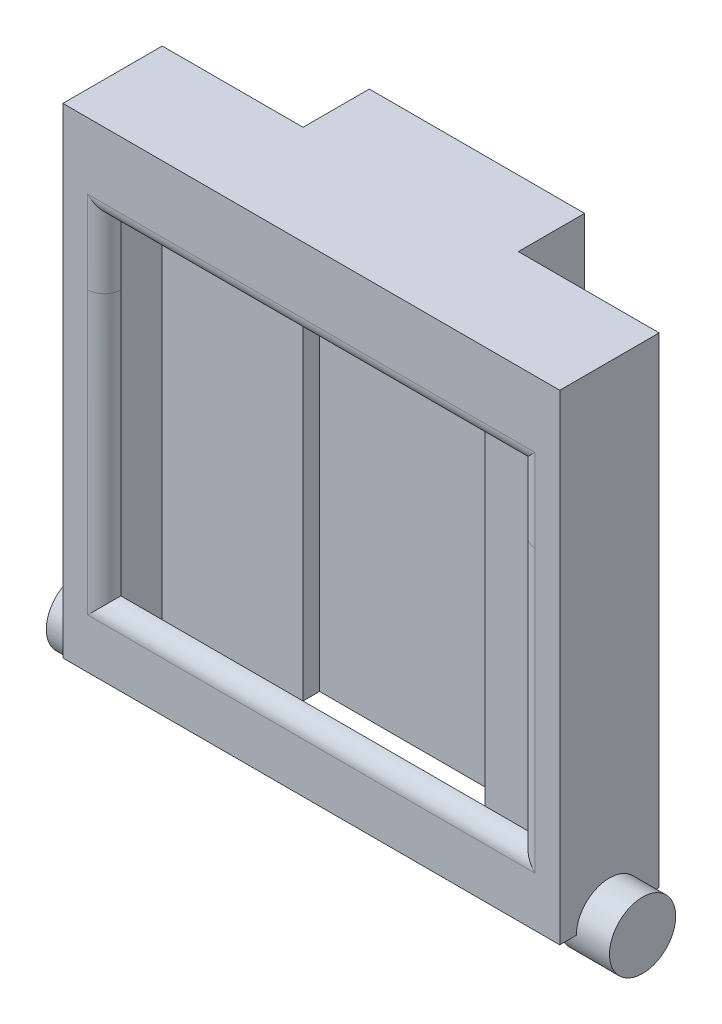
ISO-10303-21;
HEADER;
FILE_DESCRIPTION(('STEP AP214'),'2;1');
FILE_NAME('part.step','',(''),(''),'','','');
FILE_SCHEMA(('AUTOMOTIVE_DESIGN { 1 0 10303 214 1 1 1 1 }'));
ENDSEC;
DATA;
#1=APPLICATION_CONTEXT('core data for automotive mechanical design processes');
#2=APPLICATION_PROTOCOL_DEFINITION('international standard','automotive_design',2000,#1);
#3=PRODUCT_CONTEXT('',#1,'mechanical');
#4=PRODUCT('Part','Part','',(#3));
#5=PRODUCT_RELATED_PRODUCT_CATEGORY('part','',(#4));
#6=PRODUCT_DEFINITION_FORMATION('','',#4);
#7=PRODUCT_DEFINITION_CONTEXT('part definition',#1,'design');
#8=PRODUCT_DEFINITION('design','',#6,#7);
#9=PRODUCT_DEFINITION_SHAPE('','',#8);
#10=(LENGTH_UNIT() NAMED_UNIT(*) SI_UNIT(.MILLI.,.METRE.));
#11=(NAMED_UNIT(*) PLANE_ANGLE_UNIT() SI_UNIT($,.RADIAN.));
#12=(NAMED_UNIT(*) SI_UNIT($,.STERADIAN.) SOLID_ANGLE_UNIT());
#13=UNCERTAINTY_MEASURE_WITH_UNIT(LENGTH_MEASURE(1.E-05),#10,'distance_accuracy_value','');
#14=(GEOMETRIC_REPRESENTATION_CONTEXT(3) GLOBAL_UNCERTAINTY_ASSIGNED_CONTEXT((#13)) GLOBAL_UNIT_ASSIGNED_CONTEXT((#10,
#11,#12)) REPRESENTATION_CONTEXT('',''));
#15=CARTESIAN_POINT('',(0.,0.,0.));
#16=DIRECTION('',(0.,0.,1.));
#17=DIRECTION('',(1.,0.,0.));
#18=AXIS2_PLACEMENT_3D('',#15,#16,#17);
#19=CARTESIAN_POINT('',(0.,0.,-1.));
#20=DIRECTION('',(0.,0.,-1.));
#21=DIRECTION('',(-1.,0.,0.));
#22=AXIS2_PLACEMENT_3D('',#19,#20,#21);
#23=PLANE('',#22);
#24=DIRECTION('',(0.,-1.,0.));
#25=VECTOR('',#24,1.);
#26=CARTESIAN_POINT('',(20.5,29.,-1.));
#27=LINE('',#26,#25);
#28=CARTESIAN_POINT('',(20.5,29.,-1.));
#29=VERTEX_POINT('',#28);
#30=CARTESIAN_POINT('',(20.5,0.,-1.));
#31=VERTEX_POINT('',#30);
#32=EDGE_CURVE('E221',#29,#31,#27,.T.);
#33=ORIENTED_EDGE('',*,*,#32,.F.);
#34=DIRECTION('',(-1.,0.,0.));
#35=VECTOR('',#34,1.);
#36=CARTESIAN_POINT('',(0.,29.,-1.));
#37=LINE('',#36,#35);
#38=CARTESIAN_POINT('',(29.,29.,-1.));
#39=VERTEX_POINT('',#38);
#40=EDGE_CURVE('E346',#39,#29,#37,.T.);
#41=ORIENTED_EDGE('',*,*,#40,.F.);
#42=DIRECTION('',(0.,1.,0.));
#43=VECTOR('',#42,1.);
#44=CARTESIAN_POINT('',(29.,0.,-1.));
#45=LINE('',#44,#43);
#46=CARTESIAN_POINT('',(29.,0.,-1.));
#47=VERTEX_POINT('',#46);
#48=EDGE_CURVE('E360',#47,#39,#45,.T.);
#49=ORIENTED_EDGE('',*,*,#48,.F.);
#50=DIRECTION('',(1.,0.,0.));
#51=VECTOR('',#50,1.);
#52=CARTESIAN_POINT('',(0.,0.,-1.));
#53=LINE('',#52,#51);
#54=EDGE_CURVE('E78',#31,#47,#53,.T.);
#55=ORIENTED_EDGE('',*,*,#54,.F.);
#56=EDGE_LOOP('',(#33,#41,#49,#55));
#57=FACE_BOUND('',#56,.T.);
#58=ADVANCED_FACE('F34',(#57),#23,.T.);
#59=CARTESIAN_POINT('',(0.,0.,0.));
#60=DIRECTION('',(0.,0.,-1.));
#61=DIRECTION('',(-1.,0.,0.));
#62=AXIS2_PLACEMENT_3D('',#59,#60,#61);
#63=PLANE('',#62);
#64=DIRECTION('',(1.,0.,0.));
#65=VECTOR('',#64,1.);
#66=CARTESIAN_POINT('',(0.,0.,0.));
#67=LINE('',#66,#65);
#68=CARTESIAN_POINT('',(0.,0.,0.));
#69=VERTEX_POINT('',#68);
#70=CARTESIAN_POINT('',(8.5,0.,0.));
#71=VERTEX_POINT('',#70);
#72=EDGE_CURVE('E326',#69,#71,#67,.T.);
#73=ORIENTED_EDGE('',*,*,#72,.T.);
#74=DIRECTION('',(0.,-1.,0.));
#75=VECTOR('',#74,1.);
#76=CARTESIAN_POINT('',(8.5,0.,0.));
#77=LINE('',#76,#75);
#78=CARTESIAN_POINT('',(8.5,28.,0.));
#79=VERTEX_POINT('',#78);
#80=EDGE_CURVE('E268',#79,#71,#77,.T.);
#81=ORIENTED_EDGE('',*,*,#80,.F.);
#82=DIRECTION('',(-1.,0.,0.));
#83=VECTOR('',#82,1.);
#84=CARTESIAN_POINT('',(0.,28.,0.));
#85=LINE('',#84,#83);
#86=CARTESIAN_POINT('',(0.,28.,0.));
#87=VERTEX_POINT('',#86);
#88=EDGE_CURVE('E331',#79,#87,#85,.T.);
#89=ORIENTED_EDGE('',*,*,#88,.T.);
#90=DIRECTION('',(0.,-1.,0.));
#91=VECTOR('',#90,1.);
#92=CARTESIAN_POINT('',(0.,0.,0.));
#93=LINE('',#92,#91);
#94=EDGE_CURVE('E307',#87,#69,#93,.T.);
#95=ORIENTED_EDGE('',*,*,#94,.T.);
#96=EDGE_LOOP('',(#73,#81,#89,#95));
#97=FACE_BOUND('',#96,.T.);
#98=ADVANCED_FACE('F414',(#97),#63,.F.);
#99=CARTESIAN_POINT('',(0.,0.,4.));
#100=DIRECTION('',(0.,1.,0.));
#101=DIRECTION('',(0.,0.,1.));
#102=AXIS2_PLACEMENT_3D('',#99,#100,#101);
#103=PLANE('',#102);
#104=DIRECTION('',(0.,0.,1.));
#105=VECTOR('',#104,1.);
#106=CARTESIAN_POINT('',(20.5,0.,-5.));
#107=LINE('',#106,#105);
#108=CARTESIAN_POINT('',(20.5,0.,-5.));
#109=VERTEX_POINT('',#108);
#110=EDGE_CURVE('E251',#109,#31,#107,.T.);
#111=ORIENTED_EDGE('',*,*,#110,.T.);
#112=ORIENTED_EDGE('',*,*,#54,.T.);
#113=DIRECTION('',(0.,0.,-1.));
#114=VECTOR('',#113,1.);
#115=CARTESIAN_POINT('',(29.,0.,4.));
#116=LINE('',#115,#114);
#117=CARTESIAN_POINT('',(29.,0.,0.));
#118=VERTEX_POINT('',#117);
#119=EDGE_CURVE('E359',#118,#47,#116,.T.);
#120=ORIENTED_EDGE('',*,*,#119,.F.);
#121=DIRECTION('',(1.,0.,0.));
#122=VECTOR('',#121,1.);
#123=CARTESIAN_POINT('',(28.,0.,0.));
#124=LINE('',#123,#122);
#125=CARTESIAN_POINT('',(28.,0.,0.));
#126=VERTEX_POINT('',#125);
#127=EDGE_CURVE('E298',#118,#126,#124,.F.);
#128=ORIENTED_EDGE('',*,*,#127,.T.);
#129=CARTESIAN_POINT('',(19.5,0.,0.));
#130=VERTEX_POINT('',#129);
#131=EDGE_CURVE('E325',#130,#126,#67,.T.);
#132=ORIENTED_EDGE('',*,*,#131,.F.);
#133=DIRECTION('',(0.,0.,-1.));
#134=VECTOR('',#133,1.);
#135=CARTESIAN_POINT('',(19.5,0.,5.001));
#136=LINE('',#135,#134);
#137=CARTESIAN_POINT('',(19.5,0.,-1.));
#138=VERTEX_POINT('',#137);
#139=EDGE_CURVE('E259',#130,#138,#136,.T.);
#140=ORIENTED_EDGE('',*,*,#139,.T.);
#141=DIRECTION('',(-1.,0.,0.));
#142=VECTOR('',#141,1.);
#143=CARTESIAN_POINT('',(20.5,0.,-1.));
#144=LINE('',#143,#142);
#145=CARTESIAN_POINT('',(8.5,0.,-1.));
#146=VERTEX_POINT('',#145);
#147=EDGE_CURVE('E224',#138,#146,#144,.T.);
#148=ORIENTED_EDGE('',*,*,#147,.T.);
#149=DIRECTION('',(0.,0.,-1.));
#150=VECTOR('',#149,1.);
#151=CARTESIAN_POINT('',(8.5,0.,5.001));
#152=LINE('',#151,#150);
#153=EDGE_CURVE('E257',#71,#146,#152,.T.);
#154=ORIENTED_EDGE('',*,*,#153,.F.);
#155=ORIENTED_EDGE('',*,*,#72,.F.);
#156=DIRECTION('',(-1.,0.,0.));
#157=VECTOR('',#156,1.);
#158=CARTESIAN_POINT('',(0.,0.,0.));
#159=LINE('',#158,#157);
#160=CARTESIAN_POINT('',(-1.,0.,0.));
#161=VERTEX_POINT('',#160);
#162=EDGE_CURVE('E286',#69,#161,#159,.T.);
#163=ORIENTED_EDGE('',*,*,#162,.T.);
#164=DIRECTION('',(0.,0.,-1.));
#165=VECTOR('',#164,1.);
#166=CARTESIAN_POINT('',(-1.,0.,4.));
#167=LINE('',#166,#165);
#168=CARTESIAN_POINT('',(-1.,0.,-1.));
#169=VERTEX_POINT('',#168);
#170=EDGE_CURVE('E368',#161,#169,#167,.T.);
#171=ORIENTED_EDGE('',*,*,#170,.T.);
#172=CARTESIAN_POINT('',(7.5,0.,-1.));
#173=VERTEX_POINT('',#172);
#174=EDGE_CURVE('E362',#169,#173,#53,.T.);
#175=ORIENTED_EDGE('',*,*,#174,.T.);
#176=DIRECTION('',(0.,0.,1.));
#177=VECTOR('',#176,1.);
#178=CARTESIAN_POINT('',(7.5,0.,-5.));
#179=LINE('',#178,#177);
#180=CARTESIAN_POINT('',(7.5,0.,-5.));
#181=VERTEX_POINT('',#180);
#182=EDGE_CURVE('E248',#181,#173,#179,.T.);
#183=ORIENTED_EDGE('',*,*,#182,.F.);
#184=DIRECTION('',(-1.,0.,0.));
#185=VECTOR('',#184,1.);
#186=CARTESIAN_POINT('',(20.5,0.,-5.));
#187=LINE('',#186,#185);
#188=EDGE_CURVE('E231',#109,#181,#187,.T.);
#189=ORIENTED_EDGE('',*,*,#188,.F.);
#190=EDGE_LOOP('',(#111,#112,#120,#128,#132,#140,#148,#154,#155,#163,#171,#175,#183,#189));
#191=FACE_BOUND('',#190,.T.);
#192=ADVANCED_FACE('F420',(#191),#103,.F.);
#193=CARTESIAN_POINT('',(-1.,0.,5.));
#194=VERTEX_POINT('',#193);
#195=CARTESIAN_POINT('',(-1.,0.,4.));
#196=VERTEX_POINT('',#195);
#197=EDGE_CURVE('E364',#194,#196,#167,.T.);
#198=ORIENTED_EDGE('',*,*,#197,.T.);
#199=DIRECTION('',(-1.,0.,0.));
#200=VECTOR('',#199,1.);
#201=CARTESIAN_POINT('',(0.,0.,4.));
#202=LINE('',#201,#200);
#203=CARTESIAN_POINT('',(0.,0.,4.));
#204=VERTEX_POINT('',#203);
#205=EDGE_CURVE('E283',#196,#204,#202,.F.);
#206=ORIENTED_EDGE('',*,*,#205,.T.);
#207=DIRECTION('',(1.,0.,0.));
#208=VECTOR('',#207,1.);
#209=CARTESIAN_POINT('',(0.,0.,4.));
#210=LINE('',#209,#208);
#211=CARTESIAN_POINT('',(28.,0.,4.));
#212=VERTEX_POINT('',#211);
#213=EDGE_CURVE('E314',#204,#212,#210,.T.);
#214=ORIENTED_EDGE('',*,*,#213,.T.);
#215=DIRECTION('',(1.,0.,0.));
#216=VECTOR('',#215,1.);
#217=CARTESIAN_POINT('',(28.,0.,4.));
#218=LINE('',#217,#216);
#219=CARTESIAN_POINT('',(29.,0.,4.));
#220=VERTEX_POINT('',#219);
#221=EDGE_CURVE('E301',#212,#220,#218,.T.);
#222=ORIENTED_EDGE('',*,*,#221,.T.);
#223=CARTESIAN_POINT('',(29.,0.,5.));
#224=VERTEX_POINT('',#223);
#225=EDGE_CURVE('E371',#224,#220,#116,.T.);
#226=ORIENTED_EDGE('',*,*,#225,.F.);
#227=DIRECTION('',(1.,0.,0.));
#228=VECTOR('',#227,1.);
#229=CARTESIAN_POINT('',(0.,0.,5.));
#230=LINE('',#229,#228);
#231=EDGE_CURVE('E345',#194,#224,#230,.T.);
#232=ORIENTED_EDGE('',*,*,#231,.F.);
#233=EDGE_LOOP('',(#198,#206,#214,#222,#226,#232));
#234=FACE_BOUND('',#233,.T.);
#235=ADVANCED_FACE('F476',(#234),#103,.F.);
#236=CARTESIAN_POINT('',(-1.,0.,4.));
#237=DIRECTION('',(1.,0.,0.));
#238=DIRECTION('',(0.,0.,-1.));
#239=AXIS2_PLACEMENT_3D('',#236,#237,#238);
#240=PLANE('',#239);
#241=ORIENTED_EDGE('',*,*,#170,.F.);
#242=CARTESIAN_POINT('',(-1.,0.,2.));
#243=DIRECTION('',(1.,0.,0.));
#244=DIRECTION('',(0.,0.,-1.));
#245=AXIS2_PLACEMENT_3D('',#242,#243,#244);
#246=CIRCLE('',#245,2.);
#247=EDGE_CURVE('E280',#161,#196,#246,.T.);
#248=ORIENTED_EDGE('',*,*,#247,.T.);
#249=ORIENTED_EDGE('',*,*,#197,.F.);
#250=DIRECTION('',(0.,-1.,0.));
#251=VECTOR('',#250,1.);
#252=CARTESIAN_POINT('',(-1.,0.,5.));
#253=LINE('',#252,#251);
#254=CARTESIAN_POINT('',(-1.,29.,5.));
#255=VERTEX_POINT('',#254);
#256=EDGE_CURVE('E342',#255,#194,#253,.T.);
#257=ORIENTED_EDGE('',*,*,#256,.F.);
#258=DIRECTION('',(0.,0.,-1.));
#259=VECTOR('',#258,1.);
#260=CARTESIAN_POINT('',(-1.,29.,4.));
#261=LINE('',#260,#259);
#262=CARTESIAN_POINT('',(-1.,29.,-1.));
#263=VERTEX_POINT('',#262);
#264=EDGE_CURVE('E347',#255,#263,#261,.T.);
#265=ORIENTED_EDGE('',*,*,#264,.T.);
#266=DIRECTION('',(0.,-1.,0.));
#267=VECTOR('',#266,1.);
#268=CARTESIAN_POINT('',(-1.,0.,-1.));
#269=LINE('',#268,#267);
#270=EDGE_CURVE('E339',#263,#169,#269,.T.);
#271=ORIENTED_EDGE('',*,*,#270,.T.);
#272=EDGE_LOOP('',(#241,#248,#249,#257,#265,#271));
#273=FACE_BOUND('',#272,.T.);
#274=ADVANCED_FACE('F500',(#273),#240,.F.);
#275=CARTESIAN_POINT('',(29.,0.,4.));
#276=DIRECTION('',(-1.,0.,0.));
#277=DIRECTION('',(0.,0.,1.));
#278=AXIS2_PLACEMENT_3D('',#275,#276,#277);
#279=PLANE('',#278);
#280=ORIENTED_EDGE('',*,*,#225,.T.);
#281=CARTESIAN_POINT('',(29.,0.,2.));
#282=DIRECTION('',(-1.,0.,0.));
#283=DIRECTION('',(0.,0.,1.));
#284=AXIS2_PLACEMENT_3D('',#281,#282,#283);
#285=CIRCLE('',#284,2.);
#286=EDGE_CURVE('E295',#220,#118,#285,.T.);
#287=ORIENTED_EDGE('',*,*,#286,.T.);
#288=ORIENTED_EDGE('',*,*,#119,.T.);
#289=ORIENTED_EDGE('',*,*,#48,.T.);
#290=DIRECTION('',(0.,0.,-1.));
#291=VECTOR('',#290,1.);
#292=CARTESIAN_POINT('',(29.,29.,4.));
#293=LINE('',#292,#291);
#294=CARTESIAN_POINT('',(29.,29.,5.));
#295=VERTEX_POINT('',#294);
#296=EDGE_CURVE('E350',#295,#39,#293,.T.);
#297=ORIENTED_EDGE('',*,*,#296,.F.);
#298=DIRECTION('',(0.,1.,0.));
#299=VECTOR('',#298,1.);
#300=CARTESIAN_POINT('',(29.,0.,5.));
#301=LINE('',#300,#299);
#302=EDGE_CURVE('E356',#224,#295,#301,.T.);
#303=ORIENTED_EDGE('',*,*,#302,.F.);
#304=EDGE_LOOP('',(#280,#287,#288,#289,#297,#303));
#305=FACE_BOUND('',#304,.T.);
#306=ADVANCED_FACE('F462',(#305),#279,.F.);
#307=CARTESIAN_POINT('',(0.,29.,4.));
#308=DIRECTION('',(0.,-1.,0.));
#309=DIRECTION('',(0.,0.,-1.));
#310=AXIS2_PLACEMENT_3D('',#307,#308,#309);
#311=PLANE('',#310);
#312=DIRECTION('',(0.,0.,1.));
#313=VECTOR('',#312,1.);
#314=CARTESIAN_POINT('',(7.5,29.,-5.));
#315=LINE('',#314,#313);
#316=CARTESIAN_POINT('',(7.5,29.,-5.));
#317=VERTEX_POINT('',#316);
#318=CARTESIAN_POINT('',(7.5,29.,-1.));
#319=VERTEX_POINT('',#318);
#320=EDGE_CURVE('E245',#317,#319,#315,.T.);
#321=ORIENTED_EDGE('',*,*,#320,.T.);
#322=EDGE_CURVE('E354',#319,#263,#37,.T.);
#323=ORIENTED_EDGE('',*,*,#322,.T.);
#324=ORIENTED_EDGE('',*,*,#264,.F.);
#325=DIRECTION('',(-1.,0.,0.));
#326=VECTOR('',#325,1.);
#327=CARTESIAN_POINT('',(0.,29.,5.));
#328=LINE('',#327,#326);
#329=EDGE_CURVE('E351',#295,#255,#328,.T.);
#330=ORIENTED_EDGE('',*,*,#329,.F.);
#331=ORIENTED_EDGE('',*,*,#296,.T.);
#332=ORIENTED_EDGE('',*,*,#40,.T.);
#333=DIRECTION('',(0.,0.,1.));
#334=VECTOR('',#333,1.);
#335=CARTESIAN_POINT('',(20.5,29.,-5.));
#336=LINE('',#335,#334);
#337=CARTESIAN_POINT('',(20.5,29.,-5.));
#338=VERTEX_POINT('',#337);
#339=EDGE_CURVE('E237',#338,#29,#336,.T.);
#340=ORIENTED_EDGE('',*,*,#339,.F.);
#341=DIRECTION('',(1.,0.,0.));
#342=VECTOR('',#341,1.);
#343=CARTESIAN_POINT('',(20.5,29.,-5.));
#344=LINE('',#343,#342);
#345=EDGE_CURVE('E236',#317,#338,#344,.T.);
#346=ORIENTED_EDGE('',*,*,#345,.F.);
#347=EDGE_LOOP('',(#321,#323,#324,#330,#331,#332,#340,#346));
#348=FACE_BOUND('',#347,.T.);
#349=ADVANCED_FACE('F436',(#348),#311,.F.);
#350=CARTESIAN_POINT('',(0.,0.,5.));
#351=DIRECTION('',(0.,0.,-1.));
#352=DIRECTION('',(-1.,0.,0.));
#353=AXIS2_PLACEMENT_3D('',#350,#351,#352);
#354=PLANE('',#353);
#355=DIRECTION('',(0.,-1.,0.));
#356=VECTOR('',#355,1.);
#357=CARTESIAN_POINT('',(0.500000000000001,0.,5.));
#358=LINE('',#357,#356);
#359=CARTESIAN_POINT('',(0.5,3.,5.));
#360=VERTEX_POINT('',#359);
#361=CARTESIAN_POINT('',(0.499999999999998,20.,5.));
#362=VERTEX_POINT('',#361);
#363=EDGE_CURVE('E376',#360,#362,#358,.F.);
#364=ORIENTED_EDGE('',*,*,#363,.T.);
#365=DIRECTION('',(0.,-1.,0.));
#366=VECTOR('',#365,1.);
#367=CARTESIAN_POINT('',(0.500000000000004,0.,5.));
#368=LINE('',#367,#366);
#369=CARTESIAN_POINT('',(0.500000000000001,25.,5.));
#370=VERTEX_POINT('',#369);
#371=EDGE_CURVE('E388',#362,#370,#368,.F.);
#372=ORIENTED_EDGE('',*,*,#371,.T.);
#373=DIRECTION('',(-1.,0.,0.));
#374=VECTOR('',#373,1.);
#375=CARTESIAN_POINT('',(0.,25.,5.));
#376=LINE('',#375,#374);
#377=CARTESIAN_POINT('',(27.5,25.,5.));
#378=VERTEX_POINT('',#377);
#379=EDGE_CURVE('E59',#370,#378,#376,.F.);
#380=ORIENTED_EDGE('',*,*,#379,.T.);
#381=DIRECTION('',(0.,1.,0.));
#382=VECTOR('',#381,1.);
#383=CARTESIAN_POINT('',(27.5,0.,5.));
#384=LINE('',#383,#382);
#385=CARTESIAN_POINT('',(27.5,20.,5.));
#386=VERTEX_POINT('',#385);
#387=EDGE_CURVE('E386',#378,#386,#384,.F.);
#388=ORIENTED_EDGE('',*,*,#387,.T.);
#389=DIRECTION('',(0.,1.,0.));
#390=VECTOR('',#389,1.);
#391=CARTESIAN_POINT('',(27.5,0.,5.));
#392=LINE('',#391,#390);
#393=CARTESIAN_POINT('',(27.5,3.,5.));
#394=VERTEX_POINT('',#393);
#395=EDGE_CURVE('E379',#386,#394,#392,.F.);
#396=ORIENTED_EDGE('',*,*,#395,.T.);
#397=DIRECTION('',(1.,0.,0.));
#398=VECTOR('',#397,1.);
#399=CARTESIAN_POINT('',(0.,3.,5.));
#400=LINE('',#399,#398);
#401=EDGE_CURVE('E367',#394,#360,#400,.F.);
#402=ORIENTED_EDGE('',*,*,#401,.T.);
#403=EDGE_LOOP('',(#364,#372,#380,#388,#396,#402));
#404=FACE_BOUND('',#403,.T.);
#405=ORIENTED_EDGE('',*,*,#256,.T.);
#406=ORIENTED_EDGE('',*,*,#231,.T.);
#407=ORIENTED_EDGE('',*,*,#302,.T.);
#408=ORIENTED_EDGE('',*,*,#329,.T.);
#409=EDGE_LOOP('',(#405,#406,#407,#408));
#410=FACE_BOUND('',#409,.T.);
#411=ADVANCED_FACE('F392',(#404,#410),#354,.F.);
#412=DIRECTION('',(0.,1.,0.));
#413=VECTOR('',#412,1.);
#414=CARTESIAN_POINT('',(7.5,29.,-1.));
#415=LINE('',#414,#413);
#416=EDGE_CURVE('E232',#173,#319,#415,.T.);
#417=ORIENTED_EDGE('',*,*,#416,.F.);
#418=ORIENTED_EDGE('',*,*,#174,.F.);
#419=ORIENTED_EDGE('',*,*,#270,.F.);
#420=ORIENTED_EDGE('',*,*,#322,.F.);
#421=EDGE_LOOP('',(#417,#418,#419,#420));
#422=FACE_BOUND('',#421,.T.);
#423=ADVANCED_FACE('F416',(#422),#23,.T.);
#424=CARTESIAN_POINT('',(0.,0.,4.));
#425=DIRECTION('',(1.,0.,0.));
#426=DIRECTION('',(0.,0.,-1.));
#427=AXIS2_PLACEMENT_3D('',#424,#425,#426);
#428=PLANE('',#427);
#429=DIRECTION('',(0.,-1.,0.));
#430=VECTOR('',#429,1.);
#431=CARTESIAN_POINT('',(0.,0.,4.));
#432=LINE('',#431,#430);
#433=CARTESIAN_POINT('',(0.,28.,4.));
#434=VERTEX_POINT('',#433);
#435=EDGE_CURVE('E311',#434,#204,#432,.T.);
#436=ORIENTED_EDGE('',*,*,#435,.T.);
#437=CARTESIAN_POINT('',(0.,0.,2.));
#438=DIRECTION('',(-1.,0.,0.));
#439=DIRECTION('',(0.,0.,1.));
#440=AXIS2_PLACEMENT_3D('',#437,#438,#439);
#441=CIRCLE('',#440,2.);
#442=EDGE_CURVE('E278',#69,#204,#441,.T.);
#443=ORIENTED_EDGE('',*,*,#442,.F.);
#444=ORIENTED_EDGE('',*,*,#94,.F.);
#445=DIRECTION('',(0.,0.,-1.));
#446=VECTOR('',#445,1.);
#447=CARTESIAN_POINT('',(0.,28.,4.));
#448=LINE('',#447,#446);
#449=EDGE_CURVE('E322',#434,#87,#448,.T.);
#450=ORIENTED_EDGE('',*,*,#449,.F.);
#451=EDGE_LOOP('',(#436,#443,#444,#450));
#452=FACE_BOUND('',#451,.T.);
#453=ADVANCED_FACE('F427',(#452),#428,.T.);
#454=CARTESIAN_POINT('',(28.,0.,4.));
#455=DIRECTION('',(-1.,0.,0.));
#456=DIRECTION('',(0.,0.,1.));
#457=AXIS2_PLACEMENT_3D('',#454,#455,#456);
#458=PLANE('',#457);
#459=DIRECTION('',(0.,1.,0.));
#460=VECTOR('',#459,1.);
#461=CARTESIAN_POINT('',(28.,0.,0.));
#462=LINE('',#461,#460);
#463=CARTESIAN_POINT('',(28.,28.,0.));
#464=VERTEX_POINT('',#463);
#465=EDGE_CURVE('E329',#126,#464,#462,.T.);
#466=ORIENTED_EDGE('',*,*,#465,.F.);
#467=CARTESIAN_POINT('',(28.,0.,2.));
#468=DIRECTION('',(1.,0.,0.));
#469=DIRECTION('',(0.,0.,-1.));
#470=AXIS2_PLACEMENT_3D('',#467,#468,#469);
#471=CIRCLE('',#470,2.);
#472=EDGE_CURVE('E292',#212,#126,#471,.T.);
#473=ORIENTED_EDGE('',*,*,#472,.F.);
#474=DIRECTION('',(0.,1.,0.));
#475=VECTOR('',#474,1.);
#476=CARTESIAN_POINT('',(28.,0.,4.));
#477=LINE('',#476,#475);
#478=CARTESIAN_POINT('',(28.,28.,4.));
#479=VERTEX_POINT('',#478);
#480=EDGE_CURVE('E318',#212,#479,#477,.T.);
#481=ORIENTED_EDGE('',*,*,#480,.T.);
#482=DIRECTION('',(0.,0.,-1.));
#483=VECTOR('',#482,1.);
#484=CARTESIAN_POINT('',(28.,28.,4.));
#485=LINE('',#484,#483);
#486=EDGE_CURVE('E336',#479,#464,#485,.T.);
#487=ORIENTED_EDGE('',*,*,#486,.T.);
#488=EDGE_LOOP('',(#466,#473,#481,#487));
#489=FACE_BOUND('',#488,.T.);
#490=ADVANCED_FACE('F433',(#489),#458,.T.);
#491=CARTESIAN_POINT('',(0.,28.,4.));
#492=DIRECTION('',(0.,-1.,0.));
#493=DIRECTION('',(0.,0.,-1.));
#494=AXIS2_PLACEMENT_3D('',#491,#492,#493);
#495=PLANE('',#494);
#496=CARTESIAN_POINT('',(19.5,28.,0.));
#497=VERTEX_POINT('',#496);
#498=EDGE_CURVE('E315',#464,#497,#85,.T.);
#499=ORIENTED_EDGE('',*,*,#498,.F.);
#500=ORIENTED_EDGE('',*,*,#486,.F.);
#501=DIRECTION('',(-1.,0.,0.));
#502=VECTOR('',#501,1.);
#503=CARTESIAN_POINT('',(0.,28.,4.));
#504=LINE('',#503,#502);
#505=EDGE_CURVE('E320',#479,#434,#504,.T.);
#506=ORIENTED_EDGE('',*,*,#505,.T.);
#507=ORIENTED_EDGE('',*,*,#449,.T.);
#508=ORIENTED_EDGE('',*,*,#88,.F.);
#509=DIRECTION('',(0.,0.,-1.));
#510=VECTOR('',#509,1.);
#511=CARTESIAN_POINT('',(8.5,28.,5.001));
#512=LINE('',#511,#510);
#513=CARTESIAN_POINT('',(8.5,28.,-1.));
#514=VERTEX_POINT('',#513);
#515=EDGE_CURVE('E254',#79,#514,#512,.T.);
#516=ORIENTED_EDGE('',*,*,#515,.T.);
#517=DIRECTION('',(1.,0.,0.));
#518=VECTOR('',#517,1.);
#519=CARTESIAN_POINT('',(19.5,28.,-1.));
#520=LINE('',#519,#518);
#521=CARTESIAN_POINT('',(19.5,28.,-1.));
#522=VERTEX_POINT('',#521);
#523=EDGE_CURVE('E260',#514,#522,#520,.T.);
#524=ORIENTED_EDGE('',*,*,#523,.T.);
#525=DIRECTION('',(0.,0.,-1.));
#526=VECTOR('',#525,1.);
#527=CARTESIAN_POINT('',(19.5,28.,5.001));
#528=LINE('',#527,#526);
#529=EDGE_CURVE('E256',#497,#522,#528,.T.);
#530=ORIENTED_EDGE('',*,*,#529,.F.);
#531=EDGE_LOOP('',(#499,#500,#506,#507,#508,#516,#524,#530));
#532=FACE_BOUND('',#531,.T.);
#533=ADVANCED_FACE('F481',(#532),#495,.T.);
#534=CARTESIAN_POINT('',(0.,0.,4.));
#535=DIRECTION('',(0.,0.,-1.));
#536=DIRECTION('',(-1.,0.,0.));
#537=AXIS2_PLACEMENT_3D('',#534,#535,#536);
#538=PLANE('',#537);
#539=DIRECTION('',(0.,1.,0.));
#540=VECTOR('',#539,1.);
#541=CARTESIAN_POINT('',(26.5,19.,4.));
#542=LINE('',#541,#540);
#543=CARTESIAN_POINT('',(26.5,4.,4.));
#544=VERTEX_POINT('',#543);
#545=CARTESIAN_POINT('',(26.5,20.,4.));
#546=VERTEX_POINT('',#545);
#547=EDGE_CURVE('E51',#544,#546,#542,.T.);
#548=ORIENTED_EDGE('',*,*,#547,.T.);
#549=DIRECTION('',(0.,1.,0.));
#550=VECTOR('',#549,1.);
#551=CARTESIAN_POINT('',(26.5,24.,4.));
#552=LINE('',#551,#550);
#553=CARTESIAN_POINT('',(26.5,24.,4.));
#554=VERTEX_POINT('',#553);
#555=EDGE_CURVE('E211',#546,#554,#552,.T.);
#556=ORIENTED_EDGE('',*,*,#555,.T.);
#557=DIRECTION('',(-1.,0.,0.));
#558=VECTOR('',#557,1.);
#559=CARTESIAN_POINT('',(1.5,24.,4.));
#560=LINE('',#559,#558);
#561=CARTESIAN_POINT('',(1.5,24.,4.));
#562=VERTEX_POINT('',#561);
#563=EDGE_CURVE('E203',#554,#562,#560,.T.);
#564=ORIENTED_EDGE('',*,*,#563,.T.);
#565=DIRECTION('',(0.,-1.,0.));
#566=VECTOR('',#565,1.);
#567=CARTESIAN_POINT('',(1.5,24.,4.));
#568=LINE('',#567,#566);
#569=CARTESIAN_POINT('',(1.5,20.,4.));
#570=VERTEX_POINT('',#569);
#571=EDGE_CURVE('E208',#562,#570,#568,.T.);
#572=ORIENTED_EDGE('',*,*,#571,.T.);
#573=DIRECTION('',(0.,-1.,0.));
#574=VECTOR('',#573,1.);
#575=CARTESIAN_POINT('',(1.5,19.,4.));
#576=LINE('',#575,#574);
#577=CARTESIAN_POINT('',(1.5,4.,4.));
#578=VERTEX_POINT('',#577);
#579=EDGE_CURVE('E70',#570,#578,#576,.T.);
#580=ORIENTED_EDGE('',*,*,#579,.T.);
#581=DIRECTION('',(1.,0.,0.));
#582=VECTOR('',#581,1.);
#583=CARTESIAN_POINT('',(1.5,4.,4.));
#584=LINE('',#583,#582);
#585=EDGE_CURVE('E305',#578,#544,#584,.T.);
#586=ORIENTED_EDGE('',*,*,#585,.T.);
#587=EDGE_LOOP('',(#548,#556,#564,#572,#580,#586));
#588=FACE_BOUND('',#587,.T.);
#589=ORIENTED_EDGE('',*,*,#435,.F.);
#590=ORIENTED_EDGE('',*,*,#505,.F.);
#591=ORIENTED_EDGE('',*,*,#480,.F.);
#592=ORIENTED_EDGE('',*,*,#213,.F.);
#593=EDGE_LOOP('',(#589,#590,#591,#592));
#594=FACE_BOUND('',#593,.T.);
#595=ADVANCED_FACE('F205',(#588,#594),#538,.T.);
#596=ORIENTED_EDGE('',*,*,#498,.T.);
#597=DIRECTION('',(0.,1.,0.));
#598=VECTOR('',#597,1.);
#599=CARTESIAN_POINT('',(19.5,0.,0.));
#600=LINE('',#599,#598);
#601=EDGE_CURVE('E253',#130,#497,#600,.T.);
#602=ORIENTED_EDGE('',*,*,#601,.F.);
#603=ORIENTED_EDGE('',*,*,#131,.T.);
#604=ORIENTED_EDGE('',*,*,#465,.T.);
#605=EDGE_LOOP('',(#596,#602,#603,#604));
#606=FACE_BOUND('',#605,.T.);
#607=ADVANCED_FACE('F423',(#606),#63,.F.);
#608=CARTESIAN_POINT('',(0.499999999999998,19.,4.));
#609=DIRECTION('',(0.,-1.,0.));
#610=DIRECTION('',(1.,0.,0.));
#611=AXIS2_PLACEMENT_3D('',#608,#609,#610);
#612=CYLINDRICAL_SURFACE('',#611,1.);
#613=ORIENTED_EDGE('',*,*,#579,.F.);
#614=CARTESIAN_POINT('',(0.499999999999998,20.,4.));
#615=DIRECTION('',(0.,-1.,0.));
#616=DIRECTION('',(1.,0.,0.));
#617=AXIS2_PLACEMENT_3D('',#614,#615,#616);
#618=CIRCLE('',#617,1.);
#619=EDGE_CURVE('E43',#570,#362,#618,.T.);
#620=ORIENTED_EDGE('',*,*,#619,.T.);
#621=ORIENTED_EDGE('',*,*,#363,.F.);
#622=CARTESIAN_POINT('',(0.5,3.,4.));
#623=DIRECTION('',(0.707106781186548,-0.707106781186547,0.));
#624=DIRECTION('',(-0.707106781186547,-0.707106781186548,0.));
#625=AXIS2_PLACEMENT_3D('',#622,#623,#624);
#626=ELLIPSE('',#625,1.41421356237309,1.);
#627=EDGE_CURVE('E309',#578,#360,#626,.T.);
#628=ORIENTED_EDGE('',*,*,#627,.F.);
#629=EDGE_LOOP('',(#613,#620,#621,#628));
#630=FACE_BOUND('',#629,.T.);
#631=ADVANCED_FACE('F391',(#630),#612,.T.);
#632=CARTESIAN_POINT('',(1.5,3.,4.));
#633=DIRECTION('',(1.,0.,0.));
#634=DIRECTION('',(0.,1.,0.));
#635=AXIS2_PLACEMENT_3D('',#632,#633,#634);
#636=CYLINDRICAL_SURFACE('',#635,1.);
#637=ORIENTED_EDGE('',*,*,#627,.T.);
#638=ORIENTED_EDGE('',*,*,#401,.F.);
#639=CARTESIAN_POINT('',(27.5,3.,4.));
#640=DIRECTION('',(0.707106781186547,0.707106781186548,0.));
#641=DIRECTION('',(-0.707106781186548,0.707106781186547,0.));
#642=AXIS2_PLACEMENT_3D('',#639,#640,#641);
#643=ELLIPSE('',#642,1.4142135623731,1.);
#644=EDGE_CURVE('E304',#544,#394,#643,.T.);
#645=ORIENTED_EDGE('',*,*,#644,.F.);
#646=ORIENTED_EDGE('',*,*,#585,.F.);
#647=EDGE_LOOP('',(#637,#638,#645,#646));
#648=FACE_BOUND('',#647,.T.);
#649=ADVANCED_FACE('F398',(#648),#636,.T.);
#650=CARTESIAN_POINT('',(27.5,19.,4.));
#651=DIRECTION('',(0.,1.,0.));
#652=DIRECTION('',(-1.,0.,0.));
#653=AXIS2_PLACEMENT_3D('',#650,#651,#652);
#654=CYLINDRICAL_SURFACE('',#653,1.);
#655=ORIENTED_EDGE('',*,*,#644,.T.);
#656=ORIENTED_EDGE('',*,*,#395,.F.);
#657=CARTESIAN_POINT('',(27.5,20.,4.));
#658=DIRECTION('',(0.,1.,0.));
#659=DIRECTION('',(-1.,0.,0.));
#660=AXIS2_PLACEMENT_3D('',#657,#658,#659);
#661=CIRCLE('',#660,0.999999999999998);
#662=EDGE_CURVE('E11',#386,#546,#661,.F.);
#663=ORIENTED_EDGE('',*,*,#662,.T.);
#664=ORIENTED_EDGE('',*,*,#547,.F.);
#665=EDGE_LOOP('',(#655,#656,#663,#664));
#666=FACE_BOUND('',#665,.T.);
#667=ADVANCED_FACE('F401',(#666),#654,.T.);
#668=CARTESIAN_POINT('',(28.,0.,2.));
#669=DIRECTION('',(1.,0.,0.));
#670=DIRECTION('',(0.,0.,-1.));
#671=AXIS2_PLACEMENT_3D('',#668,#669,#670);
#672=CYLINDRICAL_SURFACE('',#671,2.);
#673=CARTESIAN_POINT('',(31.,0.,2.));
#674=DIRECTION('',(1.,0.,0.));
#675=DIRECTION('',(0.,0.,-1.));
#676=AXIS2_PLACEMENT_3D('',#673,#674,#675);
#677=CIRCLE('',#676,2.);
#678=CARTESIAN_POINT('',(31.,0.,0.));
#679=VERTEX_POINT('',#678);
#680=EDGE_CURVE('E289',#679,#679,#677,.T.);
#681=ORIENTED_EDGE('',*,*,#680,.F.);
#682=EDGE_LOOP('',(#681));
#683=FACE_BOUND('',#682,.T.);
#684=ORIENTED_EDGE('',*,*,#221,.F.);
#685=ORIENTED_EDGE('',*,*,#472,.T.);
#686=ORIENTED_EDGE('',*,*,#127,.F.);
#687=ORIENTED_EDGE('',*,*,#286,.F.);
#688=EDGE_LOOP('',(#684,#685,#686,#687));
#689=FACE_BOUND('',#688,.T.);
#690=ADVANCED_FACE('F473',(#683,#689),#672,.T.);
#691=CARTESIAN_POINT('',(31.,0.,2.));
#692=DIRECTION('',(1.,0.,0.));
#693=DIRECTION('',(0.,0.,-1.));
#694=AXIS2_PLACEMENT_3D('',#691,#692,#693);
#695=PLANE('',#694);
#696=ORIENTED_EDGE('',*,*,#680,.T.);
#697=EDGE_LOOP('',(#696));
#698=FACE_BOUND('',#697,.T.);
#699=ADVANCED_FACE('F627',(#698),#695,.T.);
#700=CARTESIAN_POINT('',(0.,0.,2.));
#701=DIRECTION('',(-1.,0.,0.));
#702=DIRECTION('',(0.,0.,1.));
#703=AXIS2_PLACEMENT_3D('',#700,#701,#702);
#704=CYLINDRICAL_SURFACE('',#703,2.);
#705=CARTESIAN_POINT('',(-3.,0.,2.));
#706=DIRECTION('',(-1.,0.,0.));
#707=DIRECTION('',(0.,0.,1.));
#708=AXIS2_PLACEMENT_3D('',#705,#706,#707);
#709=CIRCLE('',#708,2.);
#710=CARTESIAN_POINT('',(-3.,0.,4.));
#711=VERTEX_POINT('',#710);
#712=EDGE_CURVE('E275',#711,#711,#709,.T.);
#713=ORIENTED_EDGE('',*,*,#712,.F.);
#714=EDGE_LOOP('',(#713));
#715=FACE_BOUND('',#714,.T.);
#716=ORIENTED_EDGE('',*,*,#162,.F.);
#717=ORIENTED_EDGE('',*,*,#442,.T.);
#718=ORIENTED_EDGE('',*,*,#205,.F.);
#719=ORIENTED_EDGE('',*,*,#247,.F.);
#720=EDGE_LOOP('',(#716,#717,#718,#719));
#721=FACE_BOUND('',#720,.T.);
#722=ADVANCED_FACE('F498',(#715,#721),#704,.T.);
#723=CARTESIAN_POINT('',(-3.,0.,2.));
#724=DIRECTION('',(-1.,0.,0.));
#725=DIRECTION('',(0.,0.,1.));
#726=AXIS2_PLACEMENT_3D('',#723,#724,#725);
#727=PLANE('',#726);
#728=ORIENTED_EDGE('',*,*,#712,.T.);
#729=EDGE_LOOP('',(#728));
#730=FACE_BOUND('',#729,.T.);
#731=ADVANCED_FACE('F646',(#730),#727,.T.);
#732=CARTESIAN_POINT('',(8.5,0.,5.001));
#733=DIRECTION('',(-1.,0.,0.));
#734=DIRECTION('',(0.,-1.,0.));
#735=AXIS2_PLACEMENT_3D('',#732,#733,#734);
#736=PLANE('',#735);
#737=ORIENTED_EDGE('',*,*,#80,.T.);
#738=ORIENTED_EDGE('',*,*,#153,.T.);
#739=DIRECTION('',(0.,1.,0.));
#740=VECTOR('',#739,1.);
#741=CARTESIAN_POINT('',(8.5,0.,-1.));
#742=LINE('',#741,#740);
#743=EDGE_CURVE('E263',#146,#514,#742,.T.);
#744=ORIENTED_EDGE('',*,*,#743,.T.);
#745=ORIENTED_EDGE('',*,*,#515,.F.);
#746=EDGE_LOOP('',(#737,#738,#744,#745));
#747=FACE_BOUND('',#746,.T.);
#748=ADVANCED_FACE('F491',(#747),#736,.F.);
#749=CARTESIAN_POINT('',(19.5,0.,5.001));
#750=DIRECTION('',(1.,0.,0.));
#751=DIRECTION('',(0.,1.,0.));
#752=AXIS2_PLACEMENT_3D('',#749,#750,#751);
#753=PLANE('',#752);
#754=ORIENTED_EDGE('',*,*,#601,.T.);
#755=ORIENTED_EDGE('',*,*,#529,.T.);
#756=DIRECTION('',(0.,-1.,0.));
#757=VECTOR('',#756,1.);
#758=CARTESIAN_POINT('',(19.5,0.,-1.));
#759=LINE('',#758,#757);
#760=EDGE_CURVE('E266',#522,#138,#759,.T.);
#761=ORIENTED_EDGE('',*,*,#760,.T.);
#762=ORIENTED_EDGE('',*,*,#139,.F.);
#763=EDGE_LOOP('',(#754,#755,#761,#762));
#764=FACE_BOUND('',#763,.T.);
#765=ADVANCED_FACE('F486',(#764),#753,.F.);
#766=CARTESIAN_POINT('',(20.5,29.,-5.));
#767=DIRECTION('',(-1.,0.,0.));
#768=DIRECTION('',(0.,-1.,0.));
#769=AXIS2_PLACEMENT_3D('',#766,#767,#768);
#770=PLANE('',#769);
#771=ORIENTED_EDGE('',*,*,#32,.T.);
#772=ORIENTED_EDGE('',*,*,#110,.F.);
#773=DIRECTION('',(0.,-1.,0.));
#774=VECTOR('',#773,1.);
#775=CARTESIAN_POINT('',(20.5,29.,-5.));
#776=LINE('',#775,#774);
#777=EDGE_CURVE('E228',#338,#109,#776,.T.);
#778=ORIENTED_EDGE('',*,*,#777,.F.);
#779=ORIENTED_EDGE('',*,*,#339,.T.);
#780=EDGE_LOOP('',(#771,#772,#778,#779));
#781=FACE_BOUND('',#780,.T.);
#782=ADVANCED_FACE('F454',(#781),#770,.F.);
#783=CARTESIAN_POINT('',(7.5,29.,-5.));
#784=DIRECTION('',(1.,0.,0.));
#785=DIRECTION('',(0.,1.,0.));
#786=AXIS2_PLACEMENT_3D('',#783,#784,#785);
#787=PLANE('',#786);
#788=ORIENTED_EDGE('',*,*,#416,.T.);
#789=ORIENTED_EDGE('',*,*,#320,.F.);
#790=DIRECTION('',(0.,1.,0.));
#791=VECTOR('',#790,1.);
#792=CARTESIAN_POINT('',(7.5,29.,-5.));
#793=LINE('',#792,#791);
#794=EDGE_CURVE('E234',#181,#317,#793,.T.);
#795=ORIENTED_EDGE('',*,*,#794,.F.);
#796=ORIENTED_EDGE('',*,*,#182,.T.);
#797=EDGE_LOOP('',(#788,#789,#795,#796));
#798=FACE_BOUND('',#797,.T.);
#799=ADVANCED_FACE('F445',(#798),#787,.F.);
#800=CARTESIAN_POINT('',(0.,0.,-5.));
#801=DIRECTION('',(0.,0.,-1.));
#802=DIRECTION('',(-1.,0.,0.));
#803=AXIS2_PLACEMENT_3D('',#800,#801,#802);
#804=PLANE('',#803);
#805=ORIENTED_EDGE('',*,*,#777,.T.);
#806=ORIENTED_EDGE('',*,*,#188,.T.);
#807=ORIENTED_EDGE('',*,*,#794,.T.);
#808=ORIENTED_EDGE('',*,*,#345,.T.);
#809=EDGE_LOOP('',(#805,#806,#807,#808));
#810=FACE_BOUND('',#809,.T.);
#811=ADVANCED_FACE('F410',(#810),#804,.T.);
#812=CARTESIAN_POINT('',(0.,0.,-1.));
#813=DIRECTION('',(0.,0.,-1.));
#814=DIRECTION('',(-1.,0.,0.));
#815=AXIS2_PLACEMENT_3D('',#812,#813,#814);
#816=PLANE('',#815);
#817=ORIENTED_EDGE('',*,*,#743,.F.);
#818=ORIENTED_EDGE('',*,*,#147,.F.);
#819=ORIENTED_EDGE('',*,*,#760,.F.);
#820=ORIENTED_EDGE('',*,*,#523,.F.);
#821=EDGE_LOOP('',(#817,#818,#819,#820));
#822=FACE_BOUND('',#821,.T.);
#823=ADVANCED_FACE('F405',(#822),#816,.F.);
#824=CARTESIAN_POINT('',(27.5,24.,4.));
#825=DIRECTION('',(0.,1.,0.));
#826=DIRECTION('',(0.,0.,1.));
#827=AXIS2_PLACEMENT_3D('',#824,#825,#826);
#828=CYLINDRICAL_SURFACE('',#827,1.);
#829=ORIENTED_EDGE('',*,*,#662,.F.);
#830=ORIENTED_EDGE('',*,*,#387,.F.);
#831=CARTESIAN_POINT('',(27.5,25.,4.));
#832=DIRECTION('',(-0.707106781186547,0.707106781186547,0.));
#833=DIRECTION('',(0.707106781186547,0.707106781186547,0.));
#834=AXIS2_PLACEMENT_3D('',#831,#832,#833);
#835=ELLIPSE('',#834,1.41421356237309,1.);
#836=EDGE_CURVE('E38',#554,#378,#835,.T.);
#837=ORIENTED_EDGE('',*,*,#836,.F.);
#838=ORIENTED_EDGE('',*,*,#555,.F.);
#839=EDGE_LOOP('',(#829,#830,#837,#838));
#840=FACE_BOUND('',#839,.T.);
#841=ADVANCED_FACE('F36',(#840),#828,.T.);
#842=CARTESIAN_POINT('',(1.5,25.,4.));
#843=DIRECTION('',(-1.,0.,0.));
#844=DIRECTION('',(0.,0.,1.));
#845=AXIS2_PLACEMENT_3D('',#842,#843,#844);
#846=CYLINDRICAL_SURFACE('',#845,1.);
#847=ORIENTED_EDGE('',*,*,#836,.T.);
#848=ORIENTED_EDGE('',*,*,#379,.F.);
#849=CARTESIAN_POINT('',(0.500000000000001,25.,4.));
#850=DIRECTION('',(-0.707106781186547,-0.707106781186548,0.));
#851=DIRECTION('',(0.707106781186548,-0.707106781186547,0.));
#852=AXIS2_PLACEMENT_3D('',#849,#850,#851);
#853=ELLIPSE('',#852,1.4142135623731,1.);
#854=EDGE_CURVE('E217',#562,#370,#853,.T.);
#855=ORIENTED_EDGE('',*,*,#854,.F.);
#856=ORIENTED_EDGE('',*,*,#563,.F.);
#857=EDGE_LOOP('',(#847,#848,#855,#856));
#858=FACE_BOUND('',#857,.T.);
#859=ADVANCED_FACE('F218',(#858),#846,.T.);
#860=CARTESIAN_POINT('',(0.500000000000001,24.,4.));
#861=DIRECTION('',(0.,-1.,0.));
#862=DIRECTION('',(1.,0.,0.));
#863=AXIS2_PLACEMENT_3D('',#860,#861,#862);
#864=CYLINDRICAL_SURFACE('',#863,1.);
#865=ORIENTED_EDGE('',*,*,#854,.T.);
#866=ORIENTED_EDGE('',*,*,#371,.F.);
#867=ORIENTED_EDGE('',*,*,#619,.F.);
#868=ORIENTED_EDGE('',*,*,#571,.F.);
#869=EDGE_LOOP('',(#865,#866,#867,#868));
#870=FACE_BOUND('',#869,.T.);
#871=ADVANCED_FACE('F220',(#870),#864,.T.);
#872=CLOSED_SHELL('',(#58,#98,#192,#235,#274,#306,#349,#411,#423,#453,#490,#533,#595,#607,#631,
#649,#667,#690,#699,#722,#731,#748,#765,#782,#799,#811,#823,#841,#859,#871));
#873=MANIFOLD_SOLID_BREP('B2',#872);
#874=ADVANCED_BREP_SHAPE_REPRESENTATION('',(#18,#873),#14);
#875=SHAPE_DEFINITION_REPRESENTATION(#9,#874);
ENDSEC;
END-ISO-10303-21;
